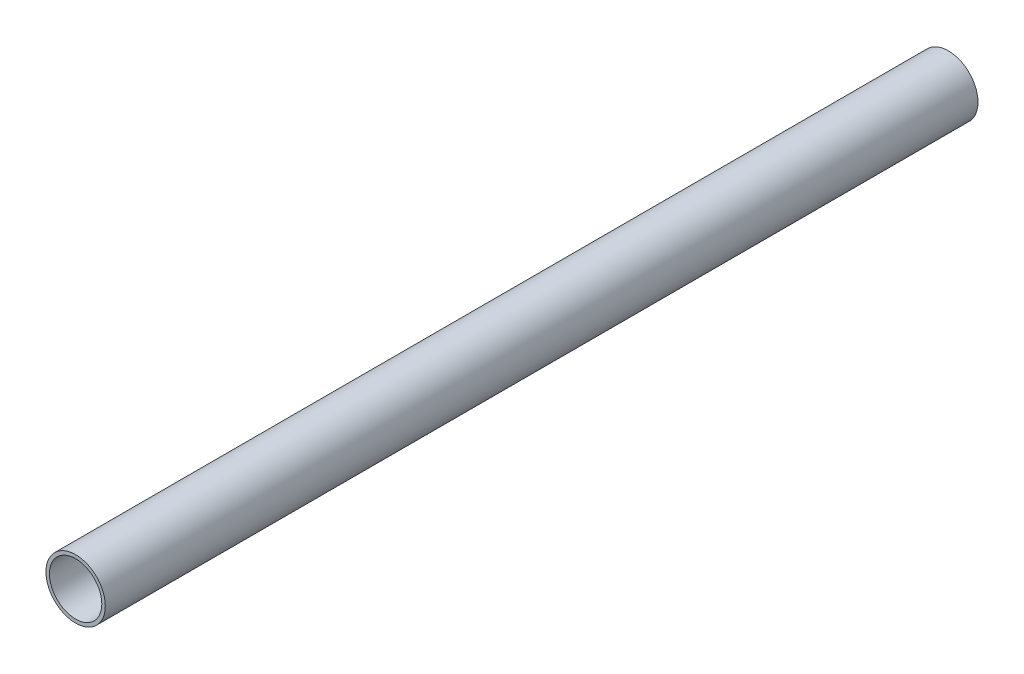
ISO-10303-21;
HEADER;
FILE_DESCRIPTION(('STEP AP214'),'2;1');
FILE_NAME('part.step','',(''),(''),'','','');
FILE_SCHEMA(('AUTOMOTIVE_DESIGN { 1 0 10303 214 1 1 1 1 }'));
ENDSEC;
DATA;
#1=APPLICATION_CONTEXT('core data for automotive mechanical design processes');
#2=APPLICATION_PROTOCOL_DEFINITION('international standard','automotive_design',2000,#1);
#3=PRODUCT_CONTEXT('',#1,'mechanical');
#4=PRODUCT('Part','Part','',(#3));
#5=PRODUCT_RELATED_PRODUCT_CATEGORY('part','',(#4));
#6=PRODUCT_DEFINITION_FORMATION('','',#4);
#7=PRODUCT_DEFINITION_CONTEXT('part definition',#1,'design');
#8=PRODUCT_DEFINITION('design','',#6,#7);
#9=PRODUCT_DEFINITION_SHAPE('','',#8);
#10=(LENGTH_UNIT() NAMED_UNIT(*) SI_UNIT(.MILLI.,.METRE.));
#11=(NAMED_UNIT(*) PLANE_ANGLE_UNIT() SI_UNIT($,.RADIAN.));
#12=(NAMED_UNIT(*) SI_UNIT($,.STERADIAN.) SOLID_ANGLE_UNIT());
#13=UNCERTAINTY_MEASURE_WITH_UNIT(LENGTH_MEASURE(1.E-05),#10,'distance_accuracy_value','');
#14=(GEOMETRIC_REPRESENTATION_CONTEXT(3) GLOBAL_UNCERTAINTY_ASSIGNED_CONTEXT((#13)) GLOBAL_UNIT_ASSIGNED_CONTEXT((#10,
#11,#12)) REPRESENTATION_CONTEXT('',''));
#15=CARTESIAN_POINT('',(0.,0.,0.));
#16=DIRECTION('',(0.,0.,1.));
#17=DIRECTION('',(1.,0.,0.));
#18=AXIS2_PLACEMENT_3D('',#15,#16,#17);
#19=CARTESIAN_POINT('',(0.,0.,500.));
#20=DIRECTION('',(0.,0.,1.));
#21=DIRECTION('',(1.,0.,0.));
#22=AXIS2_PLACEMENT_3D('',#19,#20,#21);
#23=PLANE('',#22);
#24=CARTESIAN_POINT('',(0.,0.,500.));
#25=DIRECTION('',(0.,0.,1.));
#26=DIRECTION('',(1.,0.,0.));
#27=AXIS2_PLACEMENT_3D('',#24,#25,#26);
#28=CIRCLE('',#27,17.);
#29=CARTESIAN_POINT('',(17.,0.,500.));
#30=VERTEX_POINT('',#29);
#31=EDGE_CURVE('E10',#30,#30,#28,.T.);
#32=ORIENTED_EDGE('',*,*,#31,.T.);
#33=EDGE_LOOP('',(#32));
#34=FACE_BOUND('',#33,.T.);
#35=CARTESIAN_POINT('',(0.,0.,500.));
#36=DIRECTION('',(0.,0.,1.));
#37=DIRECTION('',(1.,0.,0.));
#38=AXIS2_PLACEMENT_3D('',#35,#36,#37);
#39=CIRCLE('',#38,15.);
#40=CARTESIAN_POINT('',(15.,0.,500.));
#41=VERTEX_POINT('',#40);
#42=EDGE_CURVE('E43',#41,#41,#39,.T.);
#43=ORIENTED_EDGE('',*,*,#42,.F.);
#44=EDGE_LOOP('',(#43));
#45=FACE_BOUND('',#44,.T.);
#46=ADVANCED_FACE('F32',(#34,#45),#23,.T.);
#47=CARTESIAN_POINT('',(0.,0.,0.));
#48=DIRECTION('',(0.,0.,1.));
#49=DIRECTION('',(1.,0.,0.));
#50=AXIS2_PLACEMENT_3D('',#47,#48,#49);
#51=PLANE('',#50);
#52=CARTESIAN_POINT('',(0.,0.,0.));
#53=DIRECTION('',(0.,0.,1.));
#54=DIRECTION('',(1.,0.,0.));
#55=AXIS2_PLACEMENT_3D('',#52,#53,#54);
#56=CIRCLE('',#55,17.);
#57=CARTESIAN_POINT('',(17.,0.,0.));
#58=VERTEX_POINT('',#57);
#59=EDGE_CURVE('E36',#58,#58,#56,.T.);
#60=ORIENTED_EDGE('',*,*,#59,.F.);
#61=EDGE_LOOP('',(#60));
#62=FACE_BOUND('',#61,.T.);
#63=CARTESIAN_POINT('',(0.,0.,0.));
#64=DIRECTION('',(0.,0.,1.));
#65=DIRECTION('',(1.,0.,0.));
#66=AXIS2_PLACEMENT_3D('',#63,#64,#65);
#67=CIRCLE('',#66,15.);
#68=CARTESIAN_POINT('',(15.,0.,0.));
#69=VERTEX_POINT('',#68);
#70=EDGE_CURVE('E45',#69,#69,#67,.T.);
#71=ORIENTED_EDGE('',*,*,#70,.T.);
#72=EDGE_LOOP('',(#71));
#73=FACE_BOUND('',#72,.T.);
#74=ADVANCED_FACE('F55',(#62,#73),#51,.F.);
#75=CARTESIAN_POINT('',(0.,0.,500.));
#76=DIRECTION('',(0.,0.,-1.));
#77=DIRECTION('',(-1.,0.,0.));
#78=AXIS2_PLACEMENT_3D('',#75,#76,#77);
#79=CYLINDRICAL_SURFACE('',#78,17.);
#80=ORIENTED_EDGE('',*,*,#31,.F.);
#81=EDGE_LOOP('',(#80));
#82=FACE_BOUND('',#81,.T.);
#83=ORIENTED_EDGE('',*,*,#59,.T.);
#84=EDGE_LOOP('',(#83));
#85=FACE_BOUND('',#84,.T.);
#86=ADVANCED_FACE('F34',(#82,#85),#79,.T.);
#87=CARTESIAN_POINT('',(0.,0.,500.));
#88=DIRECTION('',(0.,0.,-1.));
#89=DIRECTION('',(-1.,0.,0.));
#90=AXIS2_PLACEMENT_3D('',#87,#88,#89);
#91=CYLINDRICAL_SURFACE('',#90,15.);
#92=ORIENTED_EDGE('',*,*,#42,.T.);
#93=EDGE_LOOP('',(#92));
#94=FACE_BOUND('',#93,.T.);
#95=ORIENTED_EDGE('',*,*,#70,.F.);
#96=EDGE_LOOP('',(#95));
#97=FACE_BOUND('',#96,.T.);
#98=ADVANCED_FACE('F51',(#94,#97),#91,.F.);
#99=CLOSED_SHELL('',(#46,#74,#86,#98));
#100=MANIFOLD_SOLID_BREP('B2',#99);
#101=ADVANCED_BREP_SHAPE_REPRESENTATION('',(#18,#100),#14);
#102=SHAPE_DEFINITION_REPRESENTATION(#9,#101);
ENDSEC;
END-ISO-10303-21;
